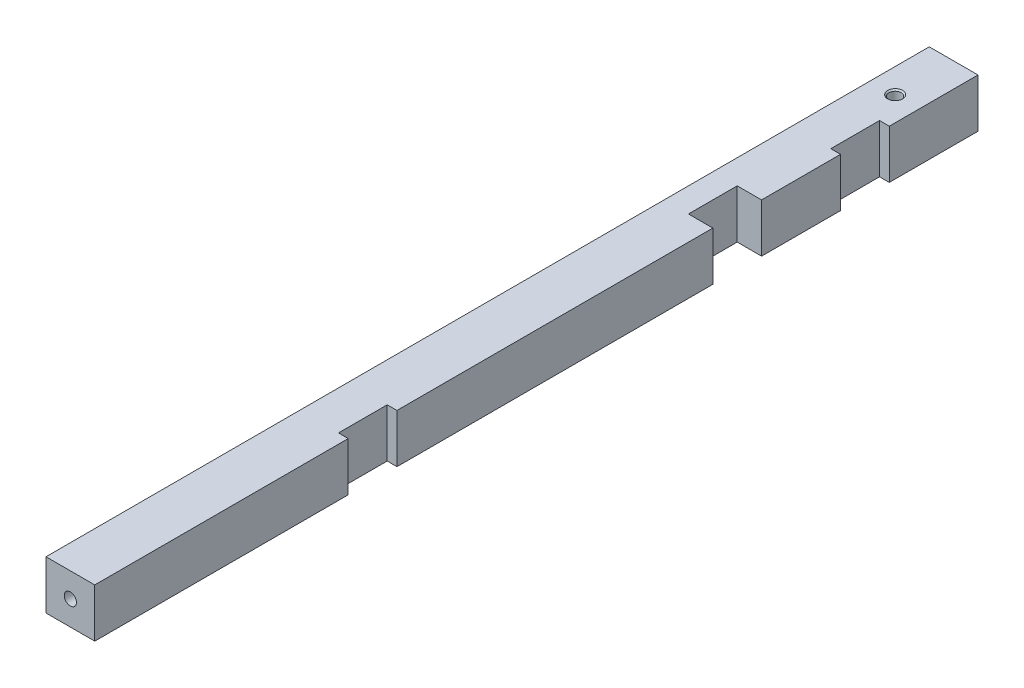
ISO-10303-21;
HEADER;
FILE_DESCRIPTION(('STEP AP214'),'2;1');
FILE_NAME('part.step','',(''),(''),'','','');
FILE_SCHEMA(('AUTOMOTIVE_DESIGN { 1 0 10303 214 1 1 1 1 }'));
ENDSEC;
DATA;
#1=APPLICATION_CONTEXT('core data for automotive mechanical design processes');
#2=APPLICATION_PROTOCOL_DEFINITION('international standard','automotive_design',2000,#1);
#3=PRODUCT_CONTEXT('',#1,'mechanical');
#4=PRODUCT('Part','Part','',(#3));
#5=PRODUCT_RELATED_PRODUCT_CATEGORY('part','',(#4));
#6=PRODUCT_DEFINITION_FORMATION('','',#4);
#7=PRODUCT_DEFINITION_CONTEXT('part definition',#1,'design');
#8=PRODUCT_DEFINITION('design','',#6,#7);
#9=PRODUCT_DEFINITION_SHAPE('','',#8);
#10=(LENGTH_UNIT() NAMED_UNIT(*) SI_UNIT(.MILLI.,.METRE.));
#11=(NAMED_UNIT(*) PLANE_ANGLE_UNIT() SI_UNIT($,.RADIAN.));
#12=(NAMED_UNIT(*) SI_UNIT($,.STERADIAN.) SOLID_ANGLE_UNIT());
#13=UNCERTAINTY_MEASURE_WITH_UNIT(LENGTH_MEASURE(1.E-05),#10,'distance_accuracy_value','');
#14=(GEOMETRIC_REPRESENTATION_CONTEXT(3) GLOBAL_UNCERTAINTY_ASSIGNED_CONTEXT((#13)) GLOBAL_UNIT_ASSIGNED_CONTEXT((#10,
#11,#12)) REPRESENTATION_CONTEXT('',''));
#15=CARTESIAN_POINT('',(0.,0.,0.));
#16=DIRECTION('',(0.,0.,1.));
#17=DIRECTION('',(1.,0.,0.));
#18=AXIS2_PLACEMENT_3D('',#15,#16,#17);
#19=CARTESIAN_POINT('',(5.,5.,-2.));
#20=DIRECTION('',(1.,0.,0.));
#21=DIRECTION('',(0.,1.,0.));
#22=AXIS2_PLACEMENT_3D('',#19,#20,#21);
#23=PLANE('',#22);
#24=DIRECTION('',(0.,1.,0.));
#25=VECTOR('',#24,1.);
#26=CARTESIAN_POINT('',(5.,-5.,52.3999999999999));
#27=LINE('',#26,#25);
#28=CARTESIAN_POINT('',(5.,-5.,52.3999999999999));
#29=VERTEX_POINT('',#28);
#30=CARTESIAN_POINT('',(5.,5.,52.3999999999999));
#31=VERTEX_POINT('',#30);
#32=EDGE_CURVE('E305',#29,#31,#27,.T.);
#33=ORIENTED_EDGE('',*,*,#32,.T.);
#34=DIRECTION('',(0.,0.,1.));
#35=VECTOR('',#34,1.);
#36=CARTESIAN_POINT('',(5.,5.,-2.));
#37=LINE('',#36,#35);
#38=CARTESIAN_POINT('',(5.,5.,117.2));
#39=VERTEX_POINT('',#38);
#40=EDGE_CURVE('E200',#31,#39,#37,.T.);
#41=ORIENTED_EDGE('',*,*,#40,.T.);
#42=DIRECTION('',(0.,1.,0.));
#43=VECTOR('',#42,1.);
#44=CARTESIAN_POINT('',(5.,-5.,117.2));
#45=LINE('',#44,#43);
#46=CARTESIAN_POINT('',(5.,-5.,117.2));
#47=VERTEX_POINT('',#46);
#48=EDGE_CURVE('E228',#47,#39,#45,.T.);
#49=ORIENTED_EDGE('',*,*,#48,.F.);
#50=DIRECTION('',(0.,0.,1.));
#51=VECTOR('',#50,1.);
#52=CARTESIAN_POINT('',(5.,-5.,-2.));
#53=LINE('',#52,#51);
#54=EDGE_CURVE('E177',#29,#47,#53,.T.);
#55=ORIENTED_EDGE('',*,*,#54,.F.);
#56=EDGE_LOOP('',(#33,#41,#49,#55));
#57=FACE_BOUND('',#56,.T.);
#58=ADVANCED_FACE('F37',(#57),#23,.T.);
#59=DIRECTION('',(0.,1.,0.));
#60=VECTOR('',#59,1.);
#61=CARTESIAN_POINT('',(5.,-5.,42.3999999999999));
#62=LINE('',#61,#60);
#63=CARTESIAN_POINT('',(5.,-5.,42.3999999999999));
#64=VERTEX_POINT('',#63);
#65=CARTESIAN_POINT('',(5.,5.,42.3999999999999));
#66=VERTEX_POINT('',#65);
#67=EDGE_CURVE('E154',#64,#66,#62,.T.);
#68=ORIENTED_EDGE('',*,*,#67,.F.);
#69=CARTESIAN_POINT('',(5.,-5.,26.2));
#70=VERTEX_POINT('',#69);
#71=EDGE_CURVE('E166',#70,#64,#53,.T.);
#72=ORIENTED_EDGE('',*,*,#71,.F.);
#73=DIRECTION('',(0.,1.,0.));
#74=VECTOR('',#73,1.);
#75=CARTESIAN_POINT('',(5.,-5.,26.2));
#76=LINE('',#75,#74);
#77=CARTESIAN_POINT('',(5.,5.,26.2));
#78=VERTEX_POINT('',#77);
#79=EDGE_CURVE('E282',#70,#78,#76,.T.);
#80=ORIENTED_EDGE('',*,*,#79,.T.);
#81=EDGE_CURVE('E168',#78,#66,#37,.T.);
#82=ORIENTED_EDGE('',*,*,#81,.T.);
#83=EDGE_LOOP('',(#68,#72,#80,#82));
#84=FACE_BOUND('',#83,.T.);
#85=ADVANCED_FACE('F164',(#84),#23,.T.);
#86=DIRECTION('',(0.,1.,0.));
#87=VECTOR('',#86,1.);
#88=CARTESIAN_POINT('',(5.,-5.,127.2));
#89=LINE('',#88,#87);
#90=CARTESIAN_POINT('',(5.,-5.,127.2));
#91=VERTEX_POINT('',#90);
#92=CARTESIAN_POINT('',(5.,5.,127.2));
#93=VERTEX_POINT('',#92);
#94=EDGE_CURVE('E211',#91,#93,#89,.T.);
#95=ORIENTED_EDGE('',*,*,#94,.T.);
#96=CARTESIAN_POINT('',(5.,5.,179.2));
#97=VERTEX_POINT('',#96);
#98=EDGE_CURVE('E180',#93,#97,#37,.T.);
#99=ORIENTED_EDGE('',*,*,#98,.T.);
#100=DIRECTION('',(0.,1.,0.));
#101=VECTOR('',#100,1.);
#102=CARTESIAN_POINT('',(5.,5.,179.2));
#103=LINE('',#102,#101);
#104=CARTESIAN_POINT('',(5.,-5.,179.2));
#105=VERTEX_POINT('',#104);
#106=EDGE_CURVE('E209',#105,#97,#103,.T.);
#107=ORIENTED_EDGE('',*,*,#106,.F.);
#108=EDGE_CURVE('E178',#91,#105,#53,.T.);
#109=ORIENTED_EDGE('',*,*,#108,.F.);
#110=EDGE_LOOP('',(#95,#99,#107,#109));
#111=FACE_BOUND('',#110,.T.);
#112=ADVANCED_FACE('F207',(#111),#23,.T.);
#113=CARTESIAN_POINT('',(-5.,5.,-2.));
#114=DIRECTION('',(-1.,0.,0.));
#115=DIRECTION('',(0.,-1.,0.));
#116=AXIS2_PLACEMENT_3D('',#113,#114,#115);
#117=PLANE('',#116);
#118=DIRECTION('',(0.,0.,1.));
#119=VECTOR('',#118,1.);
#120=CARTESIAN_POINT('',(-5.,-5.,-2.));
#121=LINE('',#120,#119);
#122=CARTESIAN_POINT('',(-5.,-5.,-2.));
#123=VERTEX_POINT('',#122);
#124=CARTESIAN_POINT('',(-5.,-5.,179.2));
#125=VERTEX_POINT('',#124);
#126=EDGE_CURVE('E41',#123,#125,#121,.T.);
#127=ORIENTED_EDGE('',*,*,#126,.T.);
#128=DIRECTION('',(0.,-1.,0.));
#129=VECTOR('',#128,1.);
#130=CARTESIAN_POINT('',(-5.,5.,179.2));
#131=LINE('',#130,#129);
#132=CARTESIAN_POINT('',(-5.,5.,179.2));
#133=VERTEX_POINT('',#132);
#134=EDGE_CURVE('E219',#133,#125,#131,.T.);
#135=ORIENTED_EDGE('',*,*,#134,.F.);
#136=DIRECTION('',(0.,0.,1.));
#137=VECTOR('',#136,1.);
#138=CARTESIAN_POINT('',(-5.,5.,-2.));
#139=LINE('',#138,#137);
#140=CARTESIAN_POINT('',(-5.,5.,-2.));
#141=VERTEX_POINT('',#140);
#142=EDGE_CURVE('E11',#141,#133,#139,.T.);
#143=ORIENTED_EDGE('',*,*,#142,.F.);
#144=DIRECTION('',(0.,-1.,0.));
#145=VECTOR('',#144,1.);
#146=CARTESIAN_POINT('',(-5.,5.,-2.));
#147=LINE('',#146,#145);
#148=EDGE_CURVE('E223',#141,#123,#147,.T.);
#149=ORIENTED_EDGE('',*,*,#148,.T.);
#150=EDGE_LOOP('',(#127,#135,#143,#149));
#151=FACE_BOUND('',#150,.T.);
#152=ADVANCED_FACE('F39',(#151),#117,.T.);
#153=CARTESIAN_POINT('',(-5.,5.,-2.));
#154=DIRECTION('',(0.,1.,0.));
#155=DIRECTION('',(0.,0.,1.));
#156=AXIS2_PLACEMENT_3D('',#153,#154,#155);
#157=PLANE('',#156);
#158=CARTESIAN_POINT('',(0.,5.,10.));
#159=DIRECTION('',(0.,1.,0.));
#160=DIRECTION('',(0.,0.,1.));
#161=AXIS2_PLACEMENT_3D('',#158,#159,#160);
#162=CIRCLE('',#161,1.525);
#163=CARTESIAN_POINT('',(0.,5.,11.525));
#164=VERTEX_POINT('',#163);
#165=EDGE_CURVE('E343',#164,#164,#162,.T.);
#166=ORIENTED_EDGE('',*,*,#165,.F.);
#167=EDGE_LOOP('',(#166));
#168=FACE_BOUND('',#167,.T.);
#169=DIRECTION('',(1.,0.,0.));
#170=VECTOR('',#169,1.);
#171=CARTESIAN_POINT('',(5.,5.,52.3999999999999));
#172=LINE('',#171,#170);
#173=CARTESIAN_POINT('',(0.,5.,52.3999999999999));
#174=VERTEX_POINT('',#173);
#175=EDGE_CURVE('E159',#174,#31,#172,.T.);
#176=ORIENTED_EDGE('',*,*,#175,.F.);
#177=DIRECTION('',(0.,0.,1.));
#178=VECTOR('',#177,1.);
#179=CARTESIAN_POINT('',(0.,5.,52.3999999999999));
#180=LINE('',#179,#178);
#181=CARTESIAN_POINT('',(0.,5.,42.3999999999999));
#182=VERTEX_POINT('',#181);
#183=EDGE_CURVE('E332',#182,#174,#180,.T.);
#184=ORIENTED_EDGE('',*,*,#183,.F.);
#185=DIRECTION('',(-1.,0.,0.));
#186=VECTOR('',#185,1.);
#187=CARTESIAN_POINT('',(5.,5.,42.3999999999999));
#188=LINE('',#187,#186);
#189=EDGE_CURVE('E330',#66,#182,#188,.T.);
#190=ORIENTED_EDGE('',*,*,#189,.F.);
#191=ORIENTED_EDGE('',*,*,#81,.F.);
#192=DIRECTION('',(1.,0.,0.));
#193=VECTOR('',#192,1.);
#194=CARTESIAN_POINT('',(5.,5.,26.2));
#195=LINE('',#194,#193);
#196=CARTESIAN_POINT('',(2.99999999999998,5.,26.2));
#197=VERTEX_POINT('',#196);
#198=EDGE_CURVE('E319',#197,#78,#195,.T.);
#199=ORIENTED_EDGE('',*,*,#198,.F.);
#200=DIRECTION('',(0.,0.,1.));
#201=VECTOR('',#200,1.);
#202=CARTESIAN_POINT('',(2.99999999999998,5.,16.2));
#203=LINE('',#202,#201);
#204=CARTESIAN_POINT('',(2.99999999999998,5.,16.2));
#205=VERTEX_POINT('',#204);
#206=EDGE_CURVE('E310',#205,#197,#203,.T.);
#207=ORIENTED_EDGE('',*,*,#206,.F.);
#208=DIRECTION('',(-1.,0.,0.));
#209=VECTOR('',#208,1.);
#210=CARTESIAN_POINT('',(5.,5.,16.2));
#211=LINE('',#210,#209);
#212=CARTESIAN_POINT('',(5.,5.,16.2));
#213=VERTEX_POINT('',#212);
#214=EDGE_CURVE('E307',#213,#205,#211,.T.);
#215=ORIENTED_EDGE('',*,*,#214,.F.);
#216=CARTESIAN_POINT('',(5.,5.,-2.));
#217=VERTEX_POINT('',#216);
#218=EDGE_CURVE('E46',#217,#213,#37,.T.);
#219=ORIENTED_EDGE('',*,*,#218,.F.);
#220=DIRECTION('',(-1.,0.,0.));
#221=VECTOR('',#220,1.);
#222=CARTESIAN_POINT('',(-5.,5.,-2.));
#223=LINE('',#222,#221);
#224=EDGE_CURVE('E186',#217,#141,#223,.T.);
#225=ORIENTED_EDGE('',*,*,#224,.T.);
#226=ORIENTED_EDGE('',*,*,#142,.T.);
#227=DIRECTION('',(-1.,0.,0.));
#228=VECTOR('',#227,1.);
#229=CARTESIAN_POINT('',(-5.,5.,179.2));
#230=LINE('',#229,#228);
#231=EDGE_CURVE('E214',#97,#133,#230,.T.);
#232=ORIENTED_EDGE('',*,*,#231,.F.);
#233=ORIENTED_EDGE('',*,*,#98,.F.);
#234=DIRECTION('',(1.,0.,0.));
#235=VECTOR('',#234,1.);
#236=CARTESIAN_POINT('',(5.,5.,127.2));
#237=LINE('',#236,#235);
#238=CARTESIAN_POINT('',(3.,5.,127.2));
#239=VERTEX_POINT('',#238);
#240=EDGE_CURVE('E273',#239,#93,#237,.T.);
#241=ORIENTED_EDGE('',*,*,#240,.F.);
#242=DIRECTION('',(0.,0.,1.));
#243=VECTOR('',#242,1.);
#244=CARTESIAN_POINT('',(3.,5.,117.2));
#245=LINE('',#244,#243);
#246=CARTESIAN_POINT('',(3.,5.,117.2));
#247=VERTEX_POINT('',#246);
#248=EDGE_CURVE('E281',#247,#239,#245,.T.);
#249=ORIENTED_EDGE('',*,*,#248,.F.);
#250=DIRECTION('',(-1.,0.,0.));
#251=VECTOR('',#250,1.);
#252=CARTESIAN_POINT('',(5.,5.,117.2));
#253=LINE('',#252,#251);
#254=EDGE_CURVE('E278',#39,#247,#253,.T.);
#255=ORIENTED_EDGE('',*,*,#254,.F.);
#256=ORIENTED_EDGE('',*,*,#40,.F.);
#257=EDGE_LOOP('',(#176,#184,#190,#191,#199,#207,#215,#219,#225,#226,#232,#233,#241,#249,#255,#256));
#258=FACE_BOUND('',#257,.T.);
#259=ADVANCED_FACE('F216',(#168,#258),#157,.T.);
#260=DIRECTION('',(0.,1.,0.));
#261=VECTOR('',#260,1.);
#262=CARTESIAN_POINT('',(5.,-5.,16.2));
#263=LINE('',#262,#261);
#264=CARTESIAN_POINT('',(5.,-5.,16.2));
#265=VERTEX_POINT('',#264);
#266=EDGE_CURVE('E258',#265,#213,#263,.T.);
#267=ORIENTED_EDGE('',*,*,#266,.F.);
#268=CARTESIAN_POINT('',(5.,-5.,-2.));
#269=VERTEX_POINT('',#268);
#270=EDGE_CURVE('E176',#269,#265,#53,.T.);
#271=ORIENTED_EDGE('',*,*,#270,.F.);
#272=DIRECTION('',(0.,1.,0.));
#273=VECTOR('',#272,1.);
#274=CARTESIAN_POINT('',(5.,5.,-2.));
#275=LINE('',#274,#273);
#276=EDGE_CURVE('E191',#269,#217,#275,.T.);
#277=ORIENTED_EDGE('',*,*,#276,.T.);
#278=ORIENTED_EDGE('',*,*,#218,.T.);
#279=EDGE_LOOP('',(#267,#271,#277,#278));
#280=FACE_BOUND('',#279,.T.);
#281=ADVANCED_FACE('F243',(#280),#23,.T.);
#282=CARTESIAN_POINT('',(-5.,-5.,-2.));
#283=DIRECTION('',(0.,-1.,0.));
#284=DIRECTION('',(0.,0.,-1.));
#285=AXIS2_PLACEMENT_3D('',#282,#283,#284);
#286=PLANE('',#285);
#287=CARTESIAN_POINT('',(0.,-5.,10.));
#288=DIRECTION('',(0.,1.,0.));
#289=DIRECTION('',(0.,0.,1.));
#290=AXIS2_PLACEMENT_3D('',#287,#288,#289);
#291=CIRCLE('',#290,1.25);
#292=CARTESIAN_POINT('',(0.,-5.,11.25));
#293=VERTEX_POINT('',#292);
#294=EDGE_CURVE('E333',#293,#293,#291,.T.);
#295=ORIENTED_EDGE('',*,*,#294,.T.);
#296=EDGE_LOOP('',(#295));
#297=FACE_BOUND('',#296,.T.);
#298=DIRECTION('',(1.,0.,0.));
#299=VECTOR('',#298,1.);
#300=CARTESIAN_POINT('',(5.,-5.,52.3999999999999));
#301=LINE('',#300,#299);
#302=CARTESIAN_POINT('',(0.,-5.,52.3999999999999));
#303=VERTEX_POINT('',#302);
#304=EDGE_CURVE('E169',#303,#29,#301,.T.);
#305=ORIENTED_EDGE('',*,*,#304,.T.);
#306=ORIENTED_EDGE('',*,*,#54,.T.);
#307=DIRECTION('',(-1.,0.,0.));
#308=VECTOR('',#307,1.);
#309=CARTESIAN_POINT('',(5.,-5.,117.2));
#310=LINE('',#309,#308);
#311=CARTESIAN_POINT('',(3.,-5.,117.2));
#312=VERTEX_POINT('',#311);
#313=EDGE_CURVE('E269',#47,#312,#310,.T.);
#314=ORIENTED_EDGE('',*,*,#313,.T.);
#315=DIRECTION('',(0.,0.,1.));
#316=VECTOR('',#315,1.);
#317=CARTESIAN_POINT('',(3.,-5.,117.2));
#318=LINE('',#317,#316);
#319=CARTESIAN_POINT('',(3.,-5.,127.2));
#320=VERTEX_POINT('',#319);
#321=EDGE_CURVE('E272',#312,#320,#318,.T.);
#322=ORIENTED_EDGE('',*,*,#321,.T.);
#323=DIRECTION('',(1.,0.,0.));
#324=VECTOR('',#323,1.);
#325=CARTESIAN_POINT('',(5.,-5.,127.2));
#326=LINE('',#325,#324);
#327=EDGE_CURVE('E276',#320,#91,#326,.T.);
#328=ORIENTED_EDGE('',*,*,#327,.T.);
#329=ORIENTED_EDGE('',*,*,#108,.T.);
#330=DIRECTION('',(1.,0.,0.));
#331=VECTOR('',#330,1.);
#332=CARTESIAN_POINT('',(-5.,-5.,179.2));
#333=LINE('',#332,#331);
#334=EDGE_CURVE('E222',#125,#105,#333,.T.);
#335=ORIENTED_EDGE('',*,*,#334,.F.);
#336=ORIENTED_EDGE('',*,*,#126,.F.);
#337=DIRECTION('',(1.,0.,0.));
#338=VECTOR('',#337,1.);
#339=CARTESIAN_POINT('',(-5.,-5.,-2.));
#340=LINE('',#339,#338);
#341=EDGE_CURVE('E196',#123,#269,#340,.T.);
#342=ORIENTED_EDGE('',*,*,#341,.T.);
#343=ORIENTED_EDGE('',*,*,#270,.T.);
#344=DIRECTION('',(-1.,0.,0.));
#345=VECTOR('',#344,1.);
#346=CARTESIAN_POINT('',(5.,-5.,16.2));
#347=LINE('',#346,#345);
#348=CARTESIAN_POINT('',(2.99999999999998,-5.,16.2));
#349=VERTEX_POINT('',#348);
#350=EDGE_CURVE('E317',#265,#349,#347,.T.);
#351=ORIENTED_EDGE('',*,*,#350,.T.);
#352=DIRECTION('',(0.,0.,1.));
#353=VECTOR('',#352,1.);
#354=CARTESIAN_POINT('',(2.99999999999998,-5.,16.2));
#355=LINE('',#354,#353);
#356=CARTESIAN_POINT('',(2.99999999999998,-5.,26.2));
#357=VERTEX_POINT('',#356);
#358=EDGE_CURVE('E62',#349,#357,#355,.T.);
#359=ORIENTED_EDGE('',*,*,#358,.T.);
#360=DIRECTION('',(1.,0.,0.));
#361=VECTOR('',#360,1.);
#362=CARTESIAN_POINT('',(5.,-5.,26.2));
#363=LINE('',#362,#361);
#364=EDGE_CURVE('E175',#357,#70,#363,.T.);
#365=ORIENTED_EDGE('',*,*,#364,.T.);
#366=ORIENTED_EDGE('',*,*,#71,.T.);
#367=DIRECTION('',(-1.,0.,0.));
#368=VECTOR('',#367,1.);
#369=CARTESIAN_POINT('',(5.,-5.,42.3999999999999));
#370=LINE('',#369,#368);
#371=CARTESIAN_POINT('',(0.,-5.,42.3999999999999));
#372=VERTEX_POINT('',#371);
#373=EDGE_CURVE('E150',#64,#372,#370,.T.);
#374=ORIENTED_EDGE('',*,*,#373,.T.);
#375=DIRECTION('',(0.,0.,1.));
#376=VECTOR('',#375,1.);
#377=CARTESIAN_POINT('',(0.,-5.,52.3999999999999));
#378=LINE('',#377,#376);
#379=EDGE_CURVE('E54',#372,#303,#378,.T.);
#380=ORIENTED_EDGE('',*,*,#379,.T.);
#381=EDGE_LOOP('',(#305,#306,#314,#322,#328,#329,#335,#336,#342,#343,#351,#359,#365,#366,#374,#380));
#382=FACE_BOUND('',#381,.T.);
#383=ADVANCED_FACE('F173',(#297,#382),#286,.T.);
#384=CARTESIAN_POINT('',(0.,0.,-2.));
#385=DIRECTION('',(0.,0.,1.));
#386=DIRECTION('',(1.,0.,0.));
#387=AXIS2_PLACEMENT_3D('',#384,#385,#386);
#388=PLANE('',#387);
#389=ORIENTED_EDGE('',*,*,#148,.F.);
#390=ORIENTED_EDGE('',*,*,#224,.F.);
#391=ORIENTED_EDGE('',*,*,#276,.F.);
#392=ORIENTED_EDGE('',*,*,#341,.F.);
#393=EDGE_LOOP('',(#389,#390,#391,#392));
#394=FACE_BOUND('',#393,.T.);
#395=ADVANCED_FACE('F237',(#394),#388,.F.);
#396=CARTESIAN_POINT('',(-5.,229.142135623731,179.2));
#397=DIRECTION('',(0.,0.,1.));
#398=DIRECTION('',(1.,0.,0.));
#399=AXIS2_PLACEMENT_3D('',#396,#397,#398);
#400=PLANE('',#399);
#401=CARTESIAN_POINT('',(0.,0.,179.2));
#402=DIRECTION('',(0.,0.,1.));
#403=DIRECTION('',(1.,0.,0.));
#404=AXIS2_PLACEMENT_3D('',#401,#402,#403);
#405=CIRCLE('',#404,1.24999999999999);
#406=CARTESIAN_POINT('',(1.24999999999999,0.,179.2));
#407=VERTEX_POINT('',#406);
#408=EDGE_CURVE('E349',#407,#407,#405,.T.);
#409=ORIENTED_EDGE('',*,*,#408,.F.);
#410=EDGE_LOOP('',(#409));
#411=FACE_BOUND('',#410,.T.);
#412=ORIENTED_EDGE('',*,*,#231,.T.);
#413=ORIENTED_EDGE('',*,*,#134,.T.);
#414=ORIENTED_EDGE('',*,*,#334,.T.);
#415=ORIENTED_EDGE('',*,*,#106,.T.);
#416=EDGE_LOOP('',(#412,#413,#414,#415));
#417=FACE_BOUND('',#416,.T.);
#418=ADVANCED_FACE('F221',(#411,#417),#400,.T.);
#419=CARTESIAN_POINT('',(5.,-5.,127.2));
#420=DIRECTION('',(0.,0.,1.));
#421=DIRECTION('',(1.,0.,0.));
#422=AXIS2_PLACEMENT_3D('',#419,#420,#421);
#423=PLANE('',#422);
#424=ORIENTED_EDGE('',*,*,#240,.T.);
#425=ORIENTED_EDGE('',*,*,#94,.F.);
#426=ORIENTED_EDGE('',*,*,#327,.F.);
#427=DIRECTION('',(0.,1.,0.));
#428=VECTOR('',#427,1.);
#429=CARTESIAN_POINT('',(3.,-5.,127.2));
#430=LINE('',#429,#428);
#431=EDGE_CURVE('E287',#320,#239,#430,.T.);
#432=ORIENTED_EDGE('',*,*,#431,.T.);
#433=EDGE_LOOP('',(#424,#425,#426,#432));
#434=FACE_BOUND('',#433,.T.);
#435=ADVANCED_FACE('F303',(#434),#423,.F.);
#436=CARTESIAN_POINT('',(3.,-5.,117.2));
#437=DIRECTION('',(-1.,0.,0.));
#438=DIRECTION('',(0.,0.,1.));
#439=AXIS2_PLACEMENT_3D('',#436,#437,#438);
#440=PLANE('',#439);
#441=ORIENTED_EDGE('',*,*,#248,.T.);
#442=ORIENTED_EDGE('',*,*,#431,.F.);
#443=ORIENTED_EDGE('',*,*,#321,.F.);
#444=DIRECTION('',(0.,1.,0.));
#445=VECTOR('',#444,1.);
#446=CARTESIAN_POINT('',(3.,-5.,117.2));
#447=LINE('',#446,#445);
#448=EDGE_CURVE('E288',#312,#247,#447,.T.);
#449=ORIENTED_EDGE('',*,*,#448,.T.);
#450=EDGE_LOOP('',(#441,#442,#443,#449));
#451=FACE_BOUND('',#450,.T.);
#452=ADVANCED_FACE('F300',(#451),#440,.F.);
#453=CARTESIAN_POINT('',(5.,-5.,117.2));
#454=DIRECTION('',(0.,0.,-1.));
#455=DIRECTION('',(-1.,0.,0.));
#456=AXIS2_PLACEMENT_3D('',#453,#454,#455);
#457=PLANE('',#456);
#458=ORIENTED_EDGE('',*,*,#254,.T.);
#459=ORIENTED_EDGE('',*,*,#448,.F.);
#460=ORIENTED_EDGE('',*,*,#313,.F.);
#461=ORIENTED_EDGE('',*,*,#48,.T.);
#462=EDGE_LOOP('',(#458,#459,#460,#461));
#463=FACE_BOUND('',#462,.T.);
#464=ADVANCED_FACE('F296',(#463),#457,.F.);
#465=CARTESIAN_POINT('',(5.,-5.,26.2));
#466=DIRECTION('',(0.,0.,1.));
#467=DIRECTION('',(1.,0.,0.));
#468=AXIS2_PLACEMENT_3D('',#465,#466,#467);
#469=PLANE('',#468);
#470=ORIENTED_EDGE('',*,*,#198,.T.);
#471=ORIENTED_EDGE('',*,*,#79,.F.);
#472=ORIENTED_EDGE('',*,*,#364,.F.);
#473=DIRECTION('',(0.,1.,0.));
#474=VECTOR('',#473,1.);
#475=CARTESIAN_POINT('',(2.99999999999998,-5.,26.2));
#476=LINE('',#475,#474);
#477=EDGE_CURVE('E264',#357,#197,#476,.T.);
#478=ORIENTED_EDGE('',*,*,#477,.T.);
#479=EDGE_LOOP('',(#470,#471,#472,#478));
#480=FACE_BOUND('',#479,.T.);
#481=ADVANCED_FACE('F325',(#480),#469,.F.);
#482=CARTESIAN_POINT('',(2.99999999999998,-5.,16.2));
#483=DIRECTION('',(-1.,0.,0.));
#484=DIRECTION('',(0.,0.,1.));
#485=AXIS2_PLACEMENT_3D('',#482,#483,#484);
#486=PLANE('',#485);
#487=ORIENTED_EDGE('',*,*,#206,.T.);
#488=ORIENTED_EDGE('',*,*,#477,.F.);
#489=ORIENTED_EDGE('',*,*,#358,.F.);
#490=DIRECTION('',(0.,1.,0.));
#491=VECTOR('',#490,1.);
#492=CARTESIAN_POINT('',(2.99999999999998,-5.,16.2));
#493=LINE('',#492,#491);
#494=EDGE_CURVE('E262',#349,#205,#493,.T.);
#495=ORIENTED_EDGE('',*,*,#494,.T.);
#496=EDGE_LOOP('',(#487,#488,#489,#495));
#497=FACE_BOUND('',#496,.T.);
#498=ADVANCED_FACE('F328',(#497),#486,.F.);
#499=CARTESIAN_POINT('',(5.,-5.,16.2));
#500=DIRECTION('',(0.,0.,-1.));
#501=DIRECTION('',(-1.,0.,0.));
#502=AXIS2_PLACEMENT_3D('',#499,#500,#501);
#503=PLANE('',#502);
#504=ORIENTED_EDGE('',*,*,#214,.T.);
#505=ORIENTED_EDGE('',*,*,#494,.F.);
#506=ORIENTED_EDGE('',*,*,#350,.F.);
#507=ORIENTED_EDGE('',*,*,#266,.T.);
#508=EDGE_LOOP('',(#504,#505,#506,#507));
#509=FACE_BOUND('',#508,.T.);
#510=ADVANCED_FACE('F368',(#509),#503,.F.);
#511=CARTESIAN_POINT('',(5.,-5.,52.3999999999999));
#512=DIRECTION('',(0.,0.,1.));
#513=DIRECTION('',(1.,0.,0.));
#514=AXIS2_PLACEMENT_3D('',#511,#512,#513);
#515=PLANE('',#514);
#516=ORIENTED_EDGE('',*,*,#175,.T.);
#517=ORIENTED_EDGE('',*,*,#32,.F.);
#518=ORIENTED_EDGE('',*,*,#304,.F.);
#519=DIRECTION('',(0.,1.,0.));
#520=VECTOR('',#519,1.);
#521=CARTESIAN_POINT('',(0.,-5.,52.3999999999999));
#522=LINE('',#521,#520);
#523=EDGE_CURVE('E308',#303,#174,#522,.T.);
#524=ORIENTED_EDGE('',*,*,#523,.T.);
#525=EDGE_LOOP('',(#516,#517,#518,#524));
#526=FACE_BOUND('',#525,.T.);
#527=ADVANCED_FACE('F371',(#526),#515,.F.);
#528=CARTESIAN_POINT('',(0.,-5.,52.3999999999999));
#529=DIRECTION('',(-1.,0.,0.));
#530=DIRECTION('',(0.,0.,1.));
#531=AXIS2_PLACEMENT_3D('',#528,#529,#530);
#532=PLANE('',#531);
#533=ORIENTED_EDGE('',*,*,#183,.T.);
#534=ORIENTED_EDGE('',*,*,#523,.F.);
#535=ORIENTED_EDGE('',*,*,#379,.F.);
#536=DIRECTION('',(0.,1.,0.));
#537=VECTOR('',#536,1.);
#538=CARTESIAN_POINT('',(0.,-5.,42.3999999999999));
#539=LINE('',#538,#537);
#540=EDGE_CURVE('E156',#372,#182,#539,.T.);
#541=ORIENTED_EDGE('',*,*,#540,.T.);
#542=EDGE_LOOP('',(#533,#534,#535,#541));
#543=FACE_BOUND('',#542,.T.);
#544=ADVANCED_FACE('F379',(#543),#532,.F.);
#545=CARTESIAN_POINT('',(5.,-5.,42.3999999999999));
#546=DIRECTION('',(0.,0.,-1.));
#547=DIRECTION('',(-1.,0.,0.));
#548=AXIS2_PLACEMENT_3D('',#545,#546,#547);
#549=PLANE('',#548);
#550=ORIENTED_EDGE('',*,*,#189,.T.);
#551=ORIENTED_EDGE('',*,*,#540,.F.);
#552=ORIENTED_EDGE('',*,*,#373,.F.);
#553=ORIENTED_EDGE('',*,*,#67,.T.);
#554=EDGE_LOOP('',(#550,#551,#552,#553));
#555=FACE_BOUND('',#554,.T.);
#556=ADVANCED_FACE('F153',(#555),#549,.F.);
#557=CARTESIAN_POINT('',(0.,5.,10.));
#558=DIRECTION('',(0.,1.,0.));
#559=DIRECTION('',(0.,0.,1.));
#560=AXIS2_PLACEMENT_3D('',#557,#558,#559);
#561=CYLINDRICAL_SURFACE('',#560,1.25);
#562=ORIENTED_EDGE('',*,*,#294,.F.);
#563=EDGE_LOOP('',(#562));
#564=FACE_BOUND('',#563,.T.);
#565=CARTESIAN_POINT('',(0.,4.725,10.));
#566=DIRECTION('',(0.,1.,0.));
#567=DIRECTION('',(0.,0.,1.));
#568=AXIS2_PLACEMENT_3D('',#565,#566,#567);
#569=CIRCLE('',#568,1.25);
#570=CARTESIAN_POINT('',(0.,4.725,11.25));
#571=VERTEX_POINT('',#570);
#572=EDGE_CURVE('E336',#571,#571,#569,.T.);
#573=ORIENTED_EDGE('',*,*,#572,.T.);
#574=EDGE_LOOP('',(#573));
#575=FACE_BOUND('',#574,.T.);
#576=ADVANCED_FACE('F378',(#564,#575),#561,.F.);
#577=CARTESIAN_POINT('',(0.,5.,10.));
#578=DIRECTION('',(0.,1.,0.));
#579=DIRECTION('',(0.,0.,1.));
#580=AXIS2_PLACEMENT_3D('',#577,#578,#579);
#581=CONICAL_SURFACE('',#580,1.525,0.785398163397448);
#582=ORIENTED_EDGE('',*,*,#572,.F.);
#583=EDGE_LOOP('',(#582));
#584=FACE_BOUND('',#583,.T.);
#585=ORIENTED_EDGE('',*,*,#165,.T.);
#586=EDGE_LOOP('',(#585));
#587=FACE_BOUND('',#586,.T.);
#588=ADVANCED_FACE('F386',(#584,#587),#581,.F.);
#589=CARTESIAN_POINT('',(0.,0.,170.7));
#590=DIRECTION('',(0.,0.,-1.));
#591=DIRECTION('',(-1.,0.,0.));
#592=AXIS2_PLACEMENT_3D('',#589,#590,#591);
#593=PLANE('',#592);
#594=CARTESIAN_POINT('',(0.,0.,170.7));
#595=DIRECTION('',(0.,0.,1.));
#596=DIRECTION('',(1.,0.,0.));
#597=AXIS2_PLACEMENT_3D('',#594,#595,#596);
#598=CIRCLE('',#597,1.24999999999999);
#599=CARTESIAN_POINT('',(1.24999999999999,0.,170.7));
#600=VERTEX_POINT('',#599);
#601=EDGE_CURVE('E346',#600,#600,#598,.T.);
#602=ORIENTED_EDGE('',*,*,#601,.T.);
#603=EDGE_LOOP('',(#602));
#604=FACE_BOUND('',#603,.T.);
#605=ADVANCED_FACE('F390',(#604),#593,.F.);
#606=CARTESIAN_POINT('',(0.,0.,179.2));
#607=DIRECTION('',(0.,0.,1.));
#608=DIRECTION('',(1.,0.,0.));
#609=AXIS2_PLACEMENT_3D('',#606,#607,#608);
#610=CYLINDRICAL_SURFACE('',#609,1.24999999999999);
#611=ORIENTED_EDGE('',*,*,#601,.F.);
#612=EDGE_LOOP('',(#611));
#613=FACE_BOUND('',#612,.T.);
#614=ORIENTED_EDGE('',*,*,#408,.T.);
#615=EDGE_LOOP('',(#614));
#616=FACE_BOUND('',#615,.T.);
#617=ADVANCED_FACE('F353',(#613,#616),#610,.F.);
#618=CLOSED_SHELL('',(#58,#85,#112,#152,#259,#281,#383,#395,#418,#435,#452,#464,#481,#498,#510,
#527,#544,#556,#576,#588,#605,#617));
#619=MANIFOLD_SOLID_BREP('B2',#618);
#620=ADVANCED_BREP_SHAPE_REPRESENTATION('',(#18,#619),#14);
#621=SHAPE_DEFINITION_REPRESENTATION(#9,#620);
ENDSEC;
END-ISO-10303-21;
